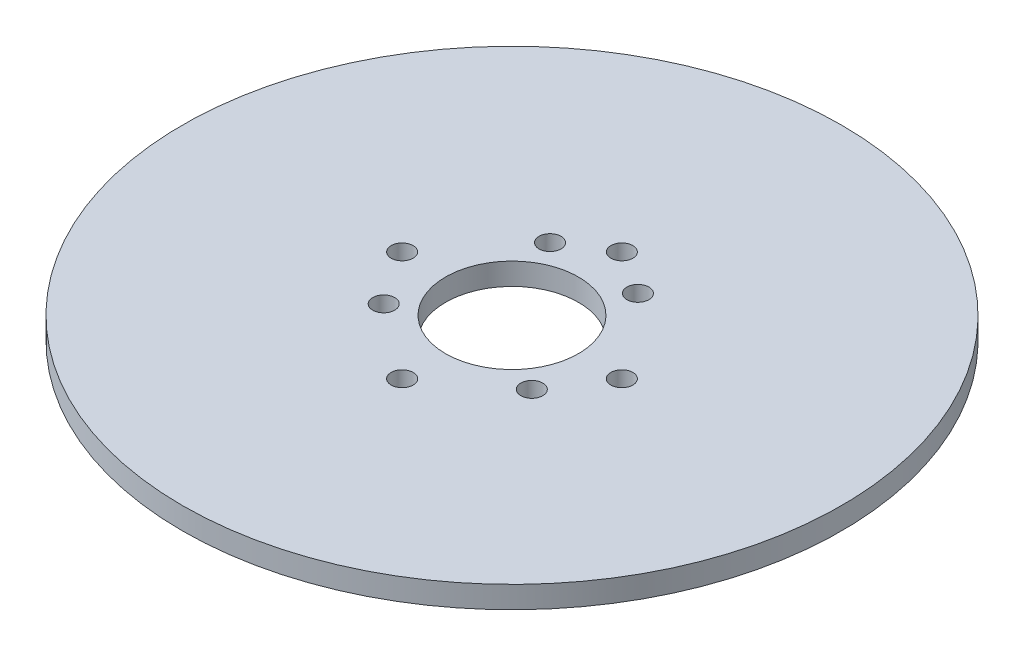
ISO-10303-21;
HEADER;
FILE_DESCRIPTION(('STEP AP214'),'2;1');
FILE_NAME('part.step','',(''),(''),'','','');
FILE_SCHEMA(('AUTOMOTIVE_DESIGN { 1 0 10303 214 1 1 1 1 }'));
ENDSEC;
DATA;
#1=APPLICATION_CONTEXT('core data for automotive mechanical design processes');
#2=APPLICATION_PROTOCOL_DEFINITION('international standard','automotive_design',2000,#1);
#3=PRODUCT_CONTEXT('',#1,'mechanical');
#4=PRODUCT('Part','Part','',(#3));
#5=PRODUCT_RELATED_PRODUCT_CATEGORY('part','',(#4));
#6=PRODUCT_DEFINITION_FORMATION('','',#4);
#7=PRODUCT_DEFINITION_CONTEXT('part definition',#1,'design');
#8=PRODUCT_DEFINITION('design','',#6,#7);
#9=PRODUCT_DEFINITION_SHAPE('','',#8);
#10=(LENGTH_UNIT() NAMED_UNIT(*) SI_UNIT(.MILLI.,.METRE.));
#11=(NAMED_UNIT(*) PLANE_ANGLE_UNIT() SI_UNIT($,.RADIAN.));
#12=(NAMED_UNIT(*) SI_UNIT($,.STERADIAN.) SOLID_ANGLE_UNIT());
#13=UNCERTAINTY_MEASURE_WITH_UNIT(LENGTH_MEASURE(1.E-05),#10,'distance_accuracy_value','');
#14=(GEOMETRIC_REPRESENTATION_CONTEXT(3) GLOBAL_UNCERTAINTY_ASSIGNED_CONTEXT((#13)) GLOBAL_UNIT_ASSIGNED_CONTEXT((#10,
#11,#12)) REPRESENTATION_CONTEXT('',''));
#15=CARTESIAN_POINT('',(0.,0.,0.));
#16=DIRECTION('',(0.,0.,1.));
#17=DIRECTION('',(1.,0.,0.));
#18=AXIS2_PLACEMENT_3D('',#15,#16,#17);
#19=CARTESIAN_POINT('',(-50.,10.,-2.99999999999999));
#20=DIRECTION('',(0.,-1.,0.));
#21=DIRECTION('',(0.,0.,-1.));
#22=AXIS2_PLACEMENT_3D('',#19,#20,#21);
#23=CYLINDRICAL_SURFACE('',#22,5.);
#24=CARTESIAN_POINT('',(-50.,10.,-2.99999999999999));
#25=DIRECTION('',(0.,1.,0.));
#26=DIRECTION('',(0.,0.,1.));
#27=AXIS2_PLACEMENT_3D('',#24,#25,#26);
#28=CIRCLE('',#27,5.);
#29=CARTESIAN_POINT('',(-50.,10.,2.00000000000001));
#30=VERTEX_POINT('',#29);
#31=EDGE_CURVE('E41',#30,#30,#28,.T.);
#32=ORIENTED_EDGE('',*,*,#31,.T.);
#33=EDGE_LOOP('',(#32));
#34=FACE_BOUND('',#33,.T.);
#35=CARTESIAN_POINT('',(-50.,0.,-2.99999999999999));
#36=DIRECTION('',(0.,1.,0.));
#37=DIRECTION('',(0.,0.,1.));
#38=AXIS2_PLACEMENT_3D('',#35,#36,#37);
#39=CIRCLE('',#38,5.);
#40=CARTESIAN_POINT('',(-50.,0.,2.00000000000001));
#41=VERTEX_POINT('',#40);
#42=EDGE_CURVE('E73',#41,#41,#39,.T.);
#43=ORIENTED_EDGE('',*,*,#42,.F.);
#44=EDGE_LOOP('',(#43));
#45=FACE_BOUND('',#44,.T.);
#46=ADVANCED_FACE('F33',(#34,#45),#23,.F.);
#47=CARTESIAN_POINT('',(0.,10.,47.));
#48=DIRECTION('',(0.,-1.,0.));
#49=DIRECTION('',(0.,0.,-1.));
#50=AXIS2_PLACEMENT_3D('',#47,#48,#49);
#51=CYLINDRICAL_SURFACE('',#50,5.);
#52=CARTESIAN_POINT('',(0.,10.,47.));
#53=DIRECTION('',(0.,1.,0.));
#54=DIRECTION('',(0.,0.,1.));
#55=AXIS2_PLACEMENT_3D('',#52,#53,#54);
#56=CIRCLE('',#55,5.);
#57=CARTESIAN_POINT('',(0.,10.,52.));
#58=VERTEX_POINT('',#57);
#59=EDGE_CURVE('E46',#58,#58,#56,.T.);
#60=ORIENTED_EDGE('',*,*,#59,.T.);
#61=EDGE_LOOP('',(#60));
#62=FACE_BOUND('',#61,.T.);
#63=CARTESIAN_POINT('',(0.,0.,47.));
#64=DIRECTION('',(0.,1.,0.));
#65=DIRECTION('',(0.,0.,1.));
#66=AXIS2_PLACEMENT_3D('',#63,#64,#65);
#67=CIRCLE('',#66,5.);
#68=CARTESIAN_POINT('',(0.,0.,52.));
#69=VERTEX_POINT('',#68);
#70=EDGE_CURVE('E71',#69,#69,#67,.T.);
#71=ORIENTED_EDGE('',*,*,#70,.F.);
#72=EDGE_LOOP('',(#71));
#73=FACE_BOUND('',#72,.T.);
#74=ADVANCED_FACE('F106',(#62,#73),#51,.F.);
#75=CARTESIAN_POINT('',(50.,10.,-3.));
#76=DIRECTION('',(0.,-1.,0.));
#77=DIRECTION('',(0.,0.,-1.));
#78=AXIS2_PLACEMENT_3D('',#75,#76,#77);
#79=CYLINDRICAL_SURFACE('',#78,5.);
#80=CARTESIAN_POINT('',(50.,10.,-3.));
#81=DIRECTION('',(0.,1.,0.));
#82=DIRECTION('',(0.,0.,1.));
#83=AXIS2_PLACEMENT_3D('',#80,#81,#82);
#84=CIRCLE('',#83,5.);
#85=CARTESIAN_POINT('',(50.,10.,1.99999999999999));
#86=VERTEX_POINT('',#85);
#87=EDGE_CURVE('E101',#86,#86,#84,.T.);
#88=ORIENTED_EDGE('',*,*,#87,.T.);
#89=EDGE_LOOP('',(#88));
#90=FACE_BOUND('',#89,.T.);
#91=CARTESIAN_POINT('',(50.,0.,-3.));
#92=DIRECTION('',(0.,1.,0.));
#93=DIRECTION('',(0.,0.,1.));
#94=AXIS2_PLACEMENT_3D('',#91,#92,#93);
#95=CIRCLE('',#94,5.);
#96=CARTESIAN_POINT('',(50.,0.,1.99999999999999));
#97=VERTEX_POINT('',#96);
#98=EDGE_CURVE('E68',#97,#97,#95,.T.);
#99=ORIENTED_EDGE('',*,*,#98,.F.);
#100=EDGE_LOOP('',(#99));
#101=FACE_BOUND('',#100,.T.);
#102=ADVANCED_FACE('F124',(#90,#101),#79,.F.);
#103=CARTESIAN_POINT('',(0.,10.,-53.));
#104=DIRECTION('',(0.,-1.,0.));
#105=DIRECTION('',(0.,0.,-1.));
#106=AXIS2_PLACEMENT_3D('',#103,#104,#105);
#107=CYLINDRICAL_SURFACE('',#106,5.);
#108=CARTESIAN_POINT('',(0.,10.,-53.));
#109=DIRECTION('',(0.,1.,0.));
#110=DIRECTION('',(0.,0.,1.));
#111=AXIS2_PLACEMENT_3D('',#108,#109,#110);
#112=CIRCLE('',#111,5.);
#113=CARTESIAN_POINT('',(0.,10.,-48.));
#114=VERTEX_POINT('',#113);
#115=EDGE_CURVE('E98',#114,#114,#112,.T.);
#116=ORIENTED_EDGE('',*,*,#115,.T.);
#117=EDGE_LOOP('',(#116));
#118=FACE_BOUND('',#117,.T.);
#119=CARTESIAN_POINT('',(0.,0.,-53.));
#120=DIRECTION('',(0.,1.,0.));
#121=DIRECTION('',(0.,0.,1.));
#122=AXIS2_PLACEMENT_3D('',#119,#120,#121);
#123=CIRCLE('',#122,5.);
#124=CARTESIAN_POINT('',(0.,0.,-48.));
#125=VERTEX_POINT('',#124);
#126=EDGE_CURVE('E65',#125,#125,#123,.T.);
#127=ORIENTED_EDGE('',*,*,#126,.F.);
#128=EDGE_LOOP('',(#127));
#129=FACE_BOUND('',#128,.T.);
#130=ADVANCED_FACE('F131',(#118,#129),#107,.F.);
#131=CARTESIAN_POINT('',(0.,10.,-3.));
#132=DIRECTION('',(0.,-1.,0.));
#133=DIRECTION('',(0.,0.,-1.));
#134=AXIS2_PLACEMENT_3D('',#131,#132,#133);
#135=CYLINDRICAL_SURFACE('',#134,30.25);
#136=CARTESIAN_POINT('',(0.,10.,-3.));
#137=DIRECTION('',(0.,1.,0.));
#138=DIRECTION('',(0.,0.,1.));
#139=AXIS2_PLACEMENT_3D('',#136,#137,#138);
#140=CIRCLE('',#139,30.25);
#141=CARTESIAN_POINT('',(0.,10.,27.25));
#142=VERTEX_POINT('',#141);
#143=EDGE_CURVE('E95',#142,#142,#140,.T.);
#144=ORIENTED_EDGE('',*,*,#143,.T.);
#145=EDGE_LOOP('',(#144));
#146=FACE_BOUND('',#145,.T.);
#147=CARTESIAN_POINT('',(0.,0.,-3.));
#148=DIRECTION('',(0.,1.,0.));
#149=DIRECTION('',(0.,0.,1.));
#150=AXIS2_PLACEMENT_3D('',#147,#148,#149);
#151=CIRCLE('',#150,30.25);
#152=CARTESIAN_POINT('',(0.,0.,27.25));
#153=VERTEX_POINT('',#152);
#154=EDGE_CURVE('E62',#153,#153,#151,.T.);
#155=ORIENTED_EDGE('',*,*,#154,.F.);
#156=EDGE_LOOP('',(#155));
#157=FACE_BOUND('',#156,.T.);
#158=ADVANCED_FACE('F135',(#146,#157),#135,.F.);
#159=CARTESIAN_POINT('',(-33.7,10.,21.6932272230723));
#160=DIRECTION('',(0.,-1.,0.));
#161=DIRECTION('',(0.,0.,-1.));
#162=AXIS2_PLACEMENT_3D('',#159,#160,#161);
#163=CYLINDRICAL_SURFACE('',#162,4.99999999999998);
#164=CARTESIAN_POINT('',(-33.7,10.,21.6932272230723));
#165=DIRECTION('',(0.,1.,0.));
#166=DIRECTION('',(0.,0.,1.));
#167=AXIS2_PLACEMENT_3D('',#164,#165,#166);
#168=CIRCLE('',#167,4.99999999999998);
#169=CARTESIAN_POINT('',(-33.7,10.,26.6932272230723));
#170=VERTEX_POINT('',#169);
#171=EDGE_CURVE('E92',#170,#170,#168,.T.);
#172=ORIENTED_EDGE('',*,*,#171,.T.);
#173=EDGE_LOOP('',(#172));
#174=FACE_BOUND('',#173,.T.);
#175=CARTESIAN_POINT('',(-33.7,0.,21.6932272230723));
#176=DIRECTION('',(0.,1.,0.));
#177=DIRECTION('',(0.,0.,1.));
#178=AXIS2_PLACEMENT_3D('',#175,#176,#177);
#179=CIRCLE('',#178,4.99999999999998);
#180=CARTESIAN_POINT('',(-33.7,0.,26.6932272230723));
#181=VERTEX_POINT('',#180);
#182=EDGE_CURVE('E59',#181,#181,#179,.T.);
#183=ORIENTED_EDGE('',*,*,#182,.F.);
#184=EDGE_LOOP('',(#183));
#185=FACE_BOUND('',#184,.T.);
#186=ADVANCED_FACE('F139',(#174,#185),#163,.F.);
#187=CARTESIAN_POINT('',(33.7,10.,21.6932272230723));
#188=DIRECTION('',(0.,-1.,0.));
#189=DIRECTION('',(0.,0.,-1.));
#190=AXIS2_PLACEMENT_3D('',#187,#188,#189);
#191=CYLINDRICAL_SURFACE('',#190,4.99999999999999);
#192=CARTESIAN_POINT('',(33.7,10.,21.6932272230723));
#193=DIRECTION('',(0.,1.,0.));
#194=DIRECTION('',(0.,0.,1.));
#195=AXIS2_PLACEMENT_3D('',#192,#193,#194);
#196=CIRCLE('',#195,4.99999999999999);
#197=CARTESIAN_POINT('',(33.7,10.,26.6932272230723));
#198=VERTEX_POINT('',#197);
#199=EDGE_CURVE('E87',#198,#198,#196,.T.);
#200=ORIENTED_EDGE('',*,*,#199,.T.);
#201=EDGE_LOOP('',(#200));
#202=FACE_BOUND('',#201,.T.);
#203=CARTESIAN_POINT('',(33.7,0.,21.6932272230723));
#204=DIRECTION('',(0.,1.,0.));
#205=DIRECTION('',(0.,0.,1.));
#206=AXIS2_PLACEMENT_3D('',#203,#204,#205);
#207=CIRCLE('',#206,4.99999999999999);
#208=CARTESIAN_POINT('',(33.7,0.,26.6932272230723));
#209=VERTEX_POINT('',#208);
#210=EDGE_CURVE('E56',#209,#209,#207,.T.);
#211=ORIENTED_EDGE('',*,*,#210,.F.);
#212=EDGE_LOOP('',(#211));
#213=FACE_BOUND('',#212,.T.);
#214=ADVANCED_FACE('F143',(#202,#213),#191,.F.);
#215=CARTESIAN_POINT('',(20.,10.,-40.3112887414928));
#216=DIRECTION('',(0.,-1.,0.));
#217=DIRECTION('',(0.,0.,-1.));
#218=AXIS2_PLACEMENT_3D('',#215,#216,#217);
#219=CYLINDRICAL_SURFACE('',#218,5.);
#220=CARTESIAN_POINT('',(20.,10.,-40.3112887414928));
#221=DIRECTION('',(0.,1.,0.));
#222=DIRECTION('',(0.,0.,1.));
#223=AXIS2_PLACEMENT_3D('',#220,#221,#222);
#224=CIRCLE('',#223,5.);
#225=CARTESIAN_POINT('',(20.,10.,-35.3112887414928));
#226=VERTEX_POINT('',#225);
#227=EDGE_CURVE('E82',#226,#226,#224,.T.);
#228=ORIENTED_EDGE('',*,*,#227,.T.);
#229=EDGE_LOOP('',(#228));
#230=FACE_BOUND('',#229,.T.);
#231=CARTESIAN_POINT('',(20.,0.,-40.3112887414928));
#232=DIRECTION('',(0.,1.,0.));
#233=DIRECTION('',(0.,0.,1.));
#234=AXIS2_PLACEMENT_3D('',#231,#232,#233);
#235=CIRCLE('',#234,5.);
#236=CARTESIAN_POINT('',(20.,0.,-35.3112887414928));
#237=VERTEX_POINT('',#236);
#238=EDGE_CURVE('E53',#237,#237,#235,.T.);
#239=ORIENTED_EDGE('',*,*,#238,.F.);
#240=EDGE_LOOP('',(#239));
#241=FACE_BOUND('',#240,.T.);
#242=ADVANCED_FACE('F146',(#230,#241),#219,.F.);
#243=CARTESIAN_POINT('',(-20.,10.,-40.3112887414928));
#244=DIRECTION('',(0.,-1.,0.));
#245=DIRECTION('',(0.,0.,-1.));
#246=AXIS2_PLACEMENT_3D('',#243,#244,#245);
#247=CYLINDRICAL_SURFACE('',#246,4.99999999999999);
#248=CARTESIAN_POINT('',(-20.,10.,-40.3112887414928));
#249=DIRECTION('',(0.,1.,0.));
#250=DIRECTION('',(0.,0.,1.));
#251=AXIS2_PLACEMENT_3D('',#248,#249,#250);
#252=CIRCLE('',#251,4.99999999999999);
#253=CARTESIAN_POINT('',(-20.,10.,-35.3112887414928));
#254=VERTEX_POINT('',#253);
#255=EDGE_CURVE('E78',#254,#254,#252,.T.);
#256=ORIENTED_EDGE('',*,*,#255,.T.);
#257=EDGE_LOOP('',(#256));
#258=FACE_BOUND('',#257,.T.);
#259=CARTESIAN_POINT('',(-20.,0.,-40.3112887414928));
#260=DIRECTION('',(0.,1.,0.));
#261=DIRECTION('',(0.,0.,1.));
#262=AXIS2_PLACEMENT_3D('',#259,#260,#261);
#263=CIRCLE('',#262,4.99999999999999);
#264=CARTESIAN_POINT('',(-20.,0.,-35.3112887414928));
#265=VERTEX_POINT('',#264);
#266=EDGE_CURVE('E50',#265,#265,#263,.T.);
#267=ORIENTED_EDGE('',*,*,#266,.F.);
#268=EDGE_LOOP('',(#267));
#269=FACE_BOUND('',#268,.T.);
#270=ADVANCED_FACE('F35',(#258,#269),#247,.F.);
#271=CARTESIAN_POINT('',(0.,10.,-3.));
#272=DIRECTION('',(0.,-1.,0.));
#273=DIRECTION('',(0.,0.,-1.));
#274=AXIS2_PLACEMENT_3D('',#271,#272,#273);
#275=CYLINDRICAL_SURFACE('',#274,150.);
#276=CARTESIAN_POINT('',(0.,10.,-3.));
#277=DIRECTION('',(0.,1.,0.));
#278=DIRECTION('',(0.,0.,1.));
#279=AXIS2_PLACEMENT_3D('',#276,#277,#278);
#280=CIRCLE('',#279,150.);
#281=CARTESIAN_POINT('',(0.,10.,147.));
#282=VERTEX_POINT('',#281);
#283=EDGE_CURVE('E10',#282,#282,#280,.T.);
#284=ORIENTED_EDGE('',*,*,#283,.F.);
#285=EDGE_LOOP('',(#284));
#286=FACE_BOUND('',#285,.T.);
#287=CARTESIAN_POINT('',(0.,0.,-3.));
#288=DIRECTION('',(0.,1.,0.));
#289=DIRECTION('',(0.,0.,1.));
#290=AXIS2_PLACEMENT_3D('',#287,#288,#289);
#291=CIRCLE('',#290,150.);
#292=CARTESIAN_POINT('',(0.,0.,147.));
#293=VERTEX_POINT('',#292);
#294=EDGE_CURVE('E37',#293,#293,#291,.T.);
#295=ORIENTED_EDGE('',*,*,#294,.T.);
#296=EDGE_LOOP('',(#295));
#297=FACE_BOUND('',#296,.T.);
#298=ADVANCED_FACE('F113',(#286,#297),#275,.T.);
#299=CARTESIAN_POINT('',(0.,10.,0.));
#300=DIRECTION('',(0.,1.,0.));
#301=DIRECTION('',(0.,0.,1.));
#302=AXIS2_PLACEMENT_3D('',#299,#300,#301);
#303=PLANE('',#302);
#304=ORIENTED_EDGE('',*,*,#255,.F.);
#305=EDGE_LOOP('',(#304));
#306=FACE_BOUND('',#305,.T.);
#307=ORIENTED_EDGE('',*,*,#227,.F.);
#308=EDGE_LOOP('',(#307));
#309=FACE_BOUND('',#308,.T.);
#310=ORIENTED_EDGE('',*,*,#199,.F.);
#311=EDGE_LOOP('',(#310));
#312=FACE_BOUND('',#311,.T.);
#313=ORIENTED_EDGE('',*,*,#171,.F.);
#314=EDGE_LOOP('',(#313));
#315=FACE_BOUND('',#314,.T.);
#316=ORIENTED_EDGE('',*,*,#143,.F.);
#317=EDGE_LOOP('',(#316));
#318=FACE_BOUND('',#317,.T.);
#319=ORIENTED_EDGE('',*,*,#115,.F.);
#320=EDGE_LOOP('',(#319));
#321=FACE_BOUND('',#320,.T.);
#322=ORIENTED_EDGE('',*,*,#87,.F.);
#323=EDGE_LOOP('',(#322));
#324=FACE_BOUND('',#323,.T.);
#325=ORIENTED_EDGE('',*,*,#59,.F.);
#326=EDGE_LOOP('',(#325));
#327=FACE_BOUND('',#326,.T.);
#328=ORIENTED_EDGE('',*,*,#31,.F.);
#329=EDGE_LOOP('',(#328));
#330=FACE_BOUND('',#329,.T.);
#331=ORIENTED_EDGE('',*,*,#283,.T.);
#332=EDGE_LOOP('',(#331));
#333=FACE_BOUND('',#332,.T.);
#334=ADVANCED_FACE('F109',(#306,#309,#312,#315,#318,#321,#324,#327,#330,#333),#303,.T.);
#335=CARTESIAN_POINT('',(0.,0.,0.));
#336=DIRECTION('',(0.,1.,0.));
#337=DIRECTION('',(0.,0.,1.));
#338=AXIS2_PLACEMENT_3D('',#335,#336,#337);
#339=PLANE('',#338);
#340=ORIENTED_EDGE('',*,*,#266,.T.);
#341=EDGE_LOOP('',(#340));
#342=FACE_BOUND('',#341,.T.);
#343=ORIENTED_EDGE('',*,*,#238,.T.);
#344=EDGE_LOOP('',(#343));
#345=FACE_BOUND('',#344,.T.);
#346=ORIENTED_EDGE('',*,*,#210,.T.);
#347=EDGE_LOOP('',(#346));
#348=FACE_BOUND('',#347,.T.);
#349=ORIENTED_EDGE('',*,*,#182,.T.);
#350=EDGE_LOOP('',(#349));
#351=FACE_BOUND('',#350,.T.);
#352=ORIENTED_EDGE('',*,*,#154,.T.);
#353=EDGE_LOOP('',(#352));
#354=FACE_BOUND('',#353,.T.);
#355=ORIENTED_EDGE('',*,*,#126,.T.);
#356=EDGE_LOOP('',(#355));
#357=FACE_BOUND('',#356,.T.);
#358=ORIENTED_EDGE('',*,*,#98,.T.);
#359=EDGE_LOOP('',(#358));
#360=FACE_BOUND('',#359,.T.);
#361=ORIENTED_EDGE('',*,*,#70,.T.);
#362=EDGE_LOOP('',(#361));
#363=FACE_BOUND('',#362,.T.);
#364=ORIENTED_EDGE('',*,*,#42,.T.);
#365=EDGE_LOOP('',(#364));
#366=FACE_BOUND('',#365,.T.);
#367=ORIENTED_EDGE('',*,*,#294,.F.);
#368=EDGE_LOOP('',(#367));
#369=FACE_BOUND('',#368,.T.);
#370=ADVANCED_FACE('F112',(#342,#345,#348,#351,#354,#357,#360,#363,#366,#369),#339,.F.);
#371=CLOSED_SHELL('',(#46,#74,#102,#130,#158,#186,#214,#242,#270,#298,#334,#370));
#372=MANIFOLD_SOLID_BREP('B2',#371);
#373=ADVANCED_BREP_SHAPE_REPRESENTATION('',(#18,#372),#14);
#374=SHAPE_DEFINITION_REPRESENTATION(#9,#373);
ENDSEC;
END-ISO-10303-21;
